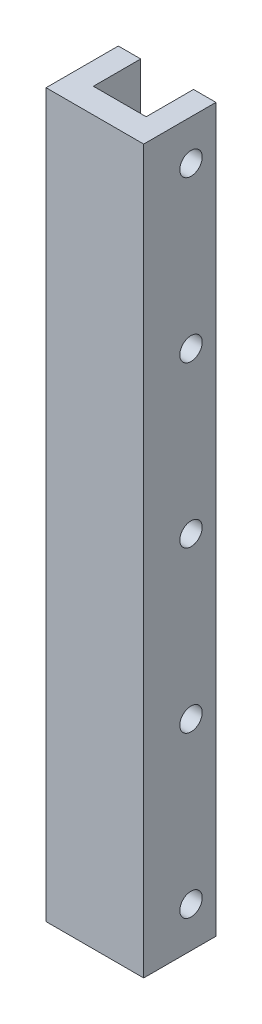
ISO-10303-21;
HEADER;
FILE_DESCRIPTION(('STEP AP214'),'2;1');
FILE_NAME('part.step','',(''),(''),'','','');
FILE_SCHEMA(('AUTOMOTIVE_DESIGN { 1 0 10303 214 1 1 1 1 }'));
ENDSEC;
DATA;
#1=APPLICATION_CONTEXT('core data for automotive mechanical design processes');
#2=APPLICATION_PROTOCOL_DEFINITION('international standard','automotive_design',2000,#1);
#3=PRODUCT_CONTEXT('',#1,'mechanical');
#4=PRODUCT('Part','Part','',(#3));
#5=PRODUCT_RELATED_PRODUCT_CATEGORY('part','',(#4));
#6=PRODUCT_DEFINITION_FORMATION('','',#4);
#7=PRODUCT_DEFINITION_CONTEXT('part definition',#1,'design');
#8=PRODUCT_DEFINITION('design','',#6,#7);
#9=PRODUCT_DEFINITION_SHAPE('','',#8);
#10=(LENGTH_UNIT() NAMED_UNIT(*) SI_UNIT(.MILLI.,.METRE.));
#11=(NAMED_UNIT(*) PLANE_ANGLE_UNIT() SI_UNIT($,.RADIAN.));
#12=(NAMED_UNIT(*) SI_UNIT($,.STERADIAN.) SOLID_ANGLE_UNIT());
#13=UNCERTAINTY_MEASURE_WITH_UNIT(LENGTH_MEASURE(1.E-05),#10,'distance_accuracy_value','');
#14=(GEOMETRIC_REPRESENTATION_CONTEXT(3) GLOBAL_UNCERTAINTY_ASSIGNED_CONTEXT((#13)) GLOBAL_UNIT_ASSIGNED_CONTEXT((#10,
#11,#12)) REPRESENTATION_CONTEXT('',''));
#15=CARTESIAN_POINT('',(0.,0.,0.));
#16=DIRECTION('',(0.,0.,1.));
#17=DIRECTION('',(1.,0.,0.));
#18=AXIS2_PLACEMENT_3D('',#15,#16,#17);
#19=CARTESIAN_POINT('',(0.,145.,-9.5));
#20=DIRECTION('',(-1.,0.,0.));
#21=DIRECTION('',(0.,0.,1.));
#22=AXIS2_PLACEMENT_3D('',#19,#20,#21);
#23=PLANE('',#22);
#24=CARTESIAN_POINT('',(0.,136.9,-4.4999999999997));
#25=DIRECTION('',(-1.,0.,0.));
#26=DIRECTION('',(0.,0.,1.));
#27=AXIS2_PLACEMENT_3D('',#24,#25,#26);
#28=CIRCLE('',#27,2.25);
#29=CARTESIAN_POINT('',(0.,136.9,-2.2499999999997));
#30=VERTEX_POINT('',#29);
#31=EDGE_CURVE('E137',#30,#30,#28,.T.);
#32=ORIENTED_EDGE('',*,*,#31,.T.);
#33=EDGE_LOOP('',(#32));
#34=FACE_BOUND('',#33,.T.);
#35=CARTESIAN_POINT('',(0.,104.7,-4.49999999999984));
#36=DIRECTION('',(-1.,0.,0.));
#37=DIRECTION('',(0.,0.,1.));
#38=AXIS2_PLACEMENT_3D('',#35,#36,#37);
#39=CIRCLE('',#38,2.25);
#40=CARTESIAN_POINT('',(0.,104.7,-2.24999999999984));
#41=VERTEX_POINT('',#40);
#42=EDGE_CURVE('E174',#41,#41,#39,.T.);
#43=ORIENTED_EDGE('',*,*,#42,.T.);
#44=EDGE_LOOP('',(#43));
#45=FACE_BOUND('',#44,.T.);
#46=CARTESIAN_POINT('',(0.,72.5,-4.49999999999995));
#47=DIRECTION('',(-1.,0.,0.));
#48=DIRECTION('',(0.,0.,1.));
#49=AXIS2_PLACEMENT_3D('',#46,#47,#48);
#50=CIRCLE('',#49,2.25);
#51=CARTESIAN_POINT('',(0.,72.5,-2.24999999999995));
#52=VERTEX_POINT('',#51);
#53=EDGE_CURVE('E171',#52,#52,#50,.T.);
#54=ORIENTED_EDGE('',*,*,#53,.T.);
#55=EDGE_LOOP('',(#54));
#56=FACE_BOUND('',#55,.T.);
#57=CARTESIAN_POINT('',(0.,8.09999999999995,-4.50000000000019));
#58=DIRECTION('',(-1.,0.,0.));
#59=DIRECTION('',(0.,0.,1.));
#60=AXIS2_PLACEMENT_3D('',#57,#58,#59);
#61=CIRCLE('',#60,2.25);
#62=CARTESIAN_POINT('',(0.,8.09999999999995,-2.25000000000019));
#63=VERTEX_POINT('',#62);
#64=EDGE_CURVE('E168',#63,#63,#61,.T.);
#65=ORIENTED_EDGE('',*,*,#64,.T.);
#66=EDGE_LOOP('',(#65));
#67=FACE_BOUND('',#66,.T.);
#68=CARTESIAN_POINT('',(0.,40.2999999999999,-4.50000000000006));
#69=DIRECTION('',(-1.,0.,0.));
#70=DIRECTION('',(0.,0.,1.));
#71=AXIS2_PLACEMENT_3D('',#68,#69,#70);
#72=CIRCLE('',#71,2.25);
#73=CARTESIAN_POINT('',(0.,40.2999999999999,-2.25000000000006));
#74=VERTEX_POINT('',#73);
#75=EDGE_CURVE('E163',#74,#74,#72,.T.);
#76=ORIENTED_EDGE('',*,*,#75,.T.);
#77=EDGE_LOOP('',(#76));
#78=FACE_BOUND('',#77,.T.);
#79=DIRECTION('',(0.,0.,-1.));
#80=VECTOR('',#79,1.);
#81=CARTESIAN_POINT('',(0.,0.,-9.5));
#82=LINE('',#81,#80);
#83=CARTESIAN_POINT('',(0.,0.,0.));
#84=VERTEX_POINT('',#83);
#85=CARTESIAN_POINT('',(0.,0.,-9.5));
#86=VERTEX_POINT('',#85);
#87=EDGE_CURVE('E133',#84,#86,#82,.T.);
#88=ORIENTED_EDGE('',*,*,#87,.T.);
#89=DIRECTION('',(0.,-1.,0.));
#90=VECTOR('',#89,1.);
#91=CARTESIAN_POINT('',(0.,145.,-9.5));
#92=LINE('',#91,#90);
#93=CARTESIAN_POINT('',(0.,145.,-9.5));
#94=VERTEX_POINT('',#93);
#95=EDGE_CURVE('E11',#94,#86,#92,.T.);
#96=ORIENTED_EDGE('',*,*,#95,.F.);
#97=DIRECTION('',(0.,0.,-1.));
#98=VECTOR('',#97,1.);
#99=CARTESIAN_POINT('',(0.,145.,-9.5));
#100=LINE('',#99,#98);
#101=CARTESIAN_POINT('',(0.,145.,0.));
#102=VERTEX_POINT('',#101);
#103=EDGE_CURVE('E148',#102,#94,#100,.T.);
#104=ORIENTED_EDGE('',*,*,#103,.F.);
#105=DIRECTION('',(0.,-1.,0.));
#106=VECTOR('',#105,1.);
#107=CARTESIAN_POINT('',(0.,145.,0.));
#108=LINE('',#107,#106);
#109=EDGE_CURVE('E129',#102,#84,#108,.T.);
#110=ORIENTED_EDGE('',*,*,#109,.T.);
#111=EDGE_LOOP('',(#88,#96,#104,#110));
#112=FACE_BOUND('',#111,.T.);
#113=ADVANCED_FACE('F35',(#34,#45,#56,#67,#78,#112),#23,.F.);
#114=CARTESIAN_POINT('',(-4.5,145.,-9.5));
#115=DIRECTION('',(0.,0.,1.));
#116=DIRECTION('',(1.,0.,0.));
#117=AXIS2_PLACEMENT_3D('',#114,#115,#116);
#118=PLANE('',#117);
#119=DIRECTION('',(-1.,0.,0.));
#120=VECTOR('',#119,1.);
#121=CARTESIAN_POINT('',(-4.5,0.,-9.5));
#122=LINE('',#121,#120);
#123=CARTESIAN_POINT('',(-4.5,0.,-9.5));
#124=VERTEX_POINT('',#123);
#125=EDGE_CURVE('E136',#86,#124,#122,.T.);
#126=ORIENTED_EDGE('',*,*,#125,.T.);
#127=DIRECTION('',(0.,-1.,0.));
#128=VECTOR('',#127,1.);
#129=CARTESIAN_POINT('',(-4.5,145.,-9.5));
#130=LINE('',#129,#128);
#131=CARTESIAN_POINT('',(-4.5,145.,-9.5));
#132=VERTEX_POINT('',#131);
#133=EDGE_CURVE('E44',#132,#124,#130,.T.);
#134=ORIENTED_EDGE('',*,*,#133,.F.);
#135=DIRECTION('',(-1.,0.,0.));
#136=VECTOR('',#135,1.);
#137=CARTESIAN_POINT('',(-4.5,145.,-9.5));
#138=LINE('',#137,#136);
#139=EDGE_CURVE('E96',#94,#132,#138,.T.);
#140=ORIENTED_EDGE('',*,*,#139,.F.);
#141=ORIENTED_EDGE('',*,*,#95,.T.);
#142=EDGE_LOOP('',(#126,#134,#140,#141));
#143=FACE_BOUND('',#142,.T.);
#144=ADVANCED_FACE('F222',(#143),#118,.F.);
#145=CARTESIAN_POINT('',(-4.5,145.,5.));
#146=DIRECTION('',(1.,0.,0.));
#147=DIRECTION('',(0.,0.,-1.));
#148=AXIS2_PLACEMENT_3D('',#145,#146,#147);
#149=PLANE('',#148);
#150=CARTESIAN_POINT('',(-4.5,136.9,-4.4999999999997));
#151=DIRECTION('',(1.,0.,0.));
#152=DIRECTION('',(0.,0.,-1.));
#153=AXIS2_PLACEMENT_3D('',#150,#151,#152);
#154=CIRCLE('',#153,2.25);
#155=CARTESIAN_POINT('',(-4.5,136.9,-6.7499999999997));
#156=VERTEX_POINT('',#155);
#157=EDGE_CURVE('E248',#156,#156,#154,.T.);
#158=ORIENTED_EDGE('',*,*,#157,.T.);
#159=EDGE_LOOP('',(#158));
#160=FACE_BOUND('',#159,.T.);
#161=CARTESIAN_POINT('',(-4.5,104.7,-4.49999999999984));
#162=DIRECTION('',(1.,0.,0.));
#163=DIRECTION('',(0.,0.,-1.));
#164=AXIS2_PLACEMENT_3D('',#161,#162,#163);
#165=CIRCLE('',#164,2.25);
#166=CARTESIAN_POINT('',(-4.5,104.7,-6.74999999999984));
#167=VERTEX_POINT('',#166);
#168=EDGE_CURVE('E254',#167,#167,#165,.T.);
#169=ORIENTED_EDGE('',*,*,#168,.T.);
#170=EDGE_LOOP('',(#169));
#171=FACE_BOUND('',#170,.T.);
#172=CARTESIAN_POINT('',(-4.5,72.5,-4.49999999999995));
#173=DIRECTION('',(1.,0.,0.));
#174=DIRECTION('',(0.,0.,-1.));
#175=AXIS2_PLACEMENT_3D('',#172,#173,#174);
#176=CIRCLE('',#175,2.25);
#177=CARTESIAN_POINT('',(-4.5,72.5,-6.74999999999995));
#178=VERTEX_POINT('',#177);
#179=EDGE_CURVE('E260',#178,#178,#176,.T.);
#180=ORIENTED_EDGE('',*,*,#179,.T.);
#181=EDGE_LOOP('',(#180));
#182=FACE_BOUND('',#181,.T.);
#183=CARTESIAN_POINT('',(-4.5,8.09999999999995,-4.50000000000019));
#184=DIRECTION('',(1.,0.,0.));
#185=DIRECTION('',(0.,0.,-1.));
#186=AXIS2_PLACEMENT_3D('',#183,#184,#185);
#187=CIRCLE('',#186,2.25);
#188=CARTESIAN_POINT('',(-4.5,8.09999999999995,-6.75000000000019));
#189=VERTEX_POINT('',#188);
#190=EDGE_CURVE('E242',#189,#189,#187,.T.);
#191=ORIENTED_EDGE('',*,*,#190,.T.);
#192=EDGE_LOOP('',(#191));
#193=FACE_BOUND('',#192,.T.);
#194=CARTESIAN_POINT('',(-4.5,40.2999999999999,-4.50000000000006));
#195=DIRECTION('',(1.,0.,0.));
#196=DIRECTION('',(0.,0.,-1.));
#197=AXIS2_PLACEMENT_3D('',#194,#195,#196);
#198=CIRCLE('',#197,2.25);
#199=CARTESIAN_POINT('',(-4.5,40.2999999999999,-6.75000000000006));
#200=VERTEX_POINT('',#199);
#201=EDGE_CURVE('E164',#200,#200,#198,.T.);
#202=ORIENTED_EDGE('',*,*,#201,.T.);
#203=EDGE_LOOP('',(#202));
#204=FACE_BOUND('',#203,.T.);
#205=DIRECTION('',(0.,0.,1.));
#206=VECTOR('',#205,1.);
#207=CARTESIAN_POINT('',(-4.5,0.,5.));
#208=LINE('',#207,#206);
#209=CARTESIAN_POINT('',(-4.5,0.,5.));
#210=VERTEX_POINT('',#209);
#211=EDGE_CURVE('E139',#124,#210,#208,.T.);
#212=ORIENTED_EDGE('',*,*,#211,.T.);
#213=DIRECTION('',(0.,-1.,0.));
#214=VECTOR('',#213,1.);
#215=CARTESIAN_POINT('',(-4.5,145.,5.));
#216=LINE('',#215,#214);
#217=CARTESIAN_POINT('',(-4.5,145.,5.));
#218=VERTEX_POINT('',#217);
#219=EDGE_CURVE('E155',#218,#210,#216,.T.);
#220=ORIENTED_EDGE('',*,*,#219,.F.);
#221=DIRECTION('',(0.,0.,1.));
#222=VECTOR('',#221,1.);
#223=CARTESIAN_POINT('',(-4.5,145.,5.));
#224=LINE('',#223,#222);
#225=EDGE_CURVE('E190',#132,#218,#224,.T.);
#226=ORIENTED_EDGE('',*,*,#225,.F.);
#227=ORIENTED_EDGE('',*,*,#133,.T.);
#228=EDGE_LOOP('',(#212,#220,#226,#227));
#229=FACE_BOUND('',#228,.T.);
#230=ADVANCED_FACE('F227',(#160,#171,#182,#193,#204,#229),#149,.F.);
#231=CARTESIAN_POINT('',(15.1,145.,5.));
#232=DIRECTION('',(0.,0.,-1.));
#233=DIRECTION('',(-1.,0.,0.));
#234=AXIS2_PLACEMENT_3D('',#231,#232,#233);
#235=PLANE('',#234);
#236=DIRECTION('',(1.,0.,0.));
#237=VECTOR('',#236,1.);
#238=CARTESIAN_POINT('',(15.1,0.,5.));
#239=LINE('',#238,#237);
#240=CARTESIAN_POINT('',(15.1,0.,5.));
#241=VERTEX_POINT('',#240);
#242=EDGE_CURVE('E141',#210,#241,#239,.T.);
#243=ORIENTED_EDGE('',*,*,#242,.T.);
#244=DIRECTION('',(0.,-1.,0.));
#245=VECTOR('',#244,1.);
#246=CARTESIAN_POINT('',(15.1,145.,5.));
#247=LINE('',#246,#245);
#248=CARTESIAN_POINT('',(15.1,145.,5.));
#249=VERTEX_POINT('',#248);
#250=EDGE_CURVE('E152',#249,#241,#247,.T.);
#251=ORIENTED_EDGE('',*,*,#250,.F.);
#252=DIRECTION('',(1.,0.,0.));
#253=VECTOR('',#252,1.);
#254=CARTESIAN_POINT('',(15.1,145.,5.));
#255=LINE('',#254,#253);
#256=EDGE_CURVE('E192',#218,#249,#255,.T.);
#257=ORIENTED_EDGE('',*,*,#256,.F.);
#258=ORIENTED_EDGE('',*,*,#219,.T.);
#259=EDGE_LOOP('',(#243,#251,#257,#258));
#260=FACE_BOUND('',#259,.T.);
#261=ADVANCED_FACE('F198',(#260),#235,.F.);
#262=CARTESIAN_POINT('',(15.1,145.,-9.5));
#263=DIRECTION('',(-1.,0.,0.));
#264=DIRECTION('',(0.,0.,1.));
#265=AXIS2_PLACEMENT_3D('',#262,#263,#264);
#266=PLANE('',#265);
#267=CARTESIAN_POINT('',(15.1,136.9,-4.49999999999971));
#268=DIRECTION('',(1.,0.,0.));
#269=DIRECTION('',(0.,0.,-1.));
#270=AXIS2_PLACEMENT_3D('',#267,#268,#269);
#271=CIRCLE('',#270,2.25);
#272=CARTESIAN_POINT('',(15.1,136.9,-6.74999999999971));
#273=VERTEX_POINT('',#272);
#274=EDGE_CURVE('E245',#273,#273,#271,.T.);
#275=ORIENTED_EDGE('',*,*,#274,.F.);
#276=EDGE_LOOP('',(#275));
#277=FACE_BOUND('',#276,.T.);
#278=CARTESIAN_POINT('',(15.1,104.7,-4.49999999999985));
#279=DIRECTION('',(1.,0.,0.));
#280=DIRECTION('',(0.,0.,-1.));
#281=AXIS2_PLACEMENT_3D('',#278,#279,#280);
#282=CIRCLE('',#281,2.25);
#283=CARTESIAN_POINT('',(15.1,104.7,-6.74999999999985));
#284=VERTEX_POINT('',#283);
#285=EDGE_CURVE('E251',#284,#284,#282,.T.);
#286=ORIENTED_EDGE('',*,*,#285,.F.);
#287=EDGE_LOOP('',(#286));
#288=FACE_BOUND('',#287,.T.);
#289=CARTESIAN_POINT('',(15.1,72.5,-4.49999999999996));
#290=DIRECTION('',(1.,0.,0.));
#291=DIRECTION('',(0.,0.,-1.));
#292=AXIS2_PLACEMENT_3D('',#289,#290,#291);
#293=CIRCLE('',#292,2.25);
#294=CARTESIAN_POINT('',(15.1,72.5,-6.74999999999996));
#295=VERTEX_POINT('',#294);
#296=EDGE_CURVE('E257',#295,#295,#293,.T.);
#297=ORIENTED_EDGE('',*,*,#296,.F.);
#298=EDGE_LOOP('',(#297));
#299=FACE_BOUND('',#298,.T.);
#300=CARTESIAN_POINT('',(15.1,8.09999999999995,-4.5000000000002));
#301=DIRECTION('',(1.,0.,0.));
#302=DIRECTION('',(0.,0.,-1.));
#303=AXIS2_PLACEMENT_3D('',#300,#301,#302);
#304=CIRCLE('',#303,2.25);
#305=CARTESIAN_POINT('',(15.1,8.09999999999995,-6.7500000000002));
#306=VERTEX_POINT('',#305);
#307=EDGE_CURVE('E263',#306,#306,#304,.T.);
#308=ORIENTED_EDGE('',*,*,#307,.F.);
#309=EDGE_LOOP('',(#308));
#310=FACE_BOUND('',#309,.T.);
#311=CARTESIAN_POINT('',(15.1,40.2999999999999,-4.50000000000007));
#312=DIRECTION('',(1.,0.,0.));
#313=DIRECTION('',(0.,0.,-1.));
#314=AXIS2_PLACEMENT_3D('',#311,#312,#313);
#315=CIRCLE('',#314,2.25);
#316=CARTESIAN_POINT('',(15.1,40.2999999999999,-6.75000000000007));
#317=VERTEX_POINT('',#316);
#318=EDGE_CURVE('E239',#317,#317,#315,.T.);
#319=ORIENTED_EDGE('',*,*,#318,.F.);
#320=EDGE_LOOP('',(#319));
#321=FACE_BOUND('',#320,.T.);
#322=DIRECTION('',(0.,0.,-1.));
#323=VECTOR('',#322,1.);
#324=CARTESIAN_POINT('',(15.1,0.,-9.5));
#325=LINE('',#324,#323);
#326=CARTESIAN_POINT('',(15.1,0.,-9.5));
#327=VERTEX_POINT('',#326);
#328=EDGE_CURVE('E143',#241,#327,#325,.T.);
#329=ORIENTED_EDGE('',*,*,#328,.T.);
#330=DIRECTION('',(0.,-1.,0.));
#331=VECTOR('',#330,1.);
#332=CARTESIAN_POINT('',(15.1,145.,-9.5));
#333=LINE('',#332,#331);
#334=CARTESIAN_POINT('',(15.1,145.,-9.5));
#335=VERTEX_POINT('',#334);
#336=EDGE_CURVE('E124',#335,#327,#333,.T.);
#337=ORIENTED_EDGE('',*,*,#336,.F.);
#338=DIRECTION('',(0.,0.,-1.));
#339=VECTOR('',#338,1.);
#340=CARTESIAN_POINT('',(15.1,145.,-9.5));
#341=LINE('',#340,#339);
#342=EDGE_CURVE('E115',#249,#335,#341,.T.);
#343=ORIENTED_EDGE('',*,*,#342,.F.);
#344=ORIENTED_EDGE('',*,*,#250,.T.);
#345=EDGE_LOOP('',(#329,#337,#343,#344));
#346=FACE_BOUND('',#345,.T.);
#347=ADVANCED_FACE('F202',(#277,#288,#299,#310,#321,#346),#266,.F.);
#348=CARTESIAN_POINT('',(10.6,145.,-9.5));
#349=DIRECTION('',(0.,0.,1.));
#350=DIRECTION('',(1.,0.,0.));
#351=AXIS2_PLACEMENT_3D('',#348,#349,#350);
#352=PLANE('',#351);
#353=DIRECTION('',(-1.,0.,0.));
#354=VECTOR('',#353,1.);
#355=CARTESIAN_POINT('',(10.6,0.,-9.5));
#356=LINE('',#355,#354);
#357=CARTESIAN_POINT('',(10.6,0.,-9.5));
#358=VERTEX_POINT('',#357);
#359=EDGE_CURVE('E123',#327,#358,#356,.T.);
#360=ORIENTED_EDGE('',*,*,#359,.T.);
#361=DIRECTION('',(0.,-1.,0.));
#362=VECTOR('',#361,1.);
#363=CARTESIAN_POINT('',(10.6,145.,-9.5));
#364=LINE('',#363,#362);
#365=CARTESIAN_POINT('',(10.6,145.,-9.5));
#366=VERTEX_POINT('',#365);
#367=EDGE_CURVE('E120',#366,#358,#364,.T.);
#368=ORIENTED_EDGE('',*,*,#367,.F.);
#369=DIRECTION('',(-1.,0.,0.));
#370=VECTOR('',#369,1.);
#371=CARTESIAN_POINT('',(10.6,145.,-9.5));
#372=LINE('',#371,#370);
#373=EDGE_CURVE('E109',#335,#366,#372,.T.);
#374=ORIENTED_EDGE('',*,*,#373,.F.);
#375=ORIENTED_EDGE('',*,*,#336,.T.);
#376=EDGE_LOOP('',(#360,#368,#374,#375));
#377=FACE_BOUND('',#376,.T.);
#378=ADVANCED_FACE('F121',(#377),#352,.F.);
#379=CARTESIAN_POINT('',(10.6,145.,0.));
#380=DIRECTION('',(1.,0.,0.));
#381=DIRECTION('',(0.,0.,-1.));
#382=AXIS2_PLACEMENT_3D('',#379,#380,#381);
#383=PLANE('',#382);
#384=CARTESIAN_POINT('',(10.6,136.9,-4.49999999999971));
#385=DIRECTION('',(1.,0.,0.));
#386=DIRECTION('',(0.,0.,-1.));
#387=AXIS2_PLACEMENT_3D('',#384,#385,#386);
#388=CIRCLE('',#387,2.25);
#389=CARTESIAN_POINT('',(10.6,136.9,-6.74999999999971));
#390=VERTEX_POINT('',#389);
#391=EDGE_CURVE('E38',#390,#390,#388,.T.);
#392=ORIENTED_EDGE('',*,*,#391,.T.);
#393=EDGE_LOOP('',(#392));
#394=FACE_BOUND('',#393,.T.);
#395=CARTESIAN_POINT('',(10.6,104.7,-4.49999999999984));
#396=DIRECTION('',(1.,0.,0.));
#397=DIRECTION('',(0.,0.,-1.));
#398=AXIS2_PLACEMENT_3D('',#395,#396,#397);
#399=CIRCLE('',#398,2.25);
#400=CARTESIAN_POINT('',(10.6,104.7,-6.74999999999984));
#401=VERTEX_POINT('',#400);
#402=EDGE_CURVE('E172',#401,#401,#399,.T.);
#403=ORIENTED_EDGE('',*,*,#402,.T.);
#404=EDGE_LOOP('',(#403));
#405=FACE_BOUND('',#404,.T.);
#406=CARTESIAN_POINT('',(10.6,72.5,-4.49999999999996));
#407=DIRECTION('',(1.,0.,0.));
#408=DIRECTION('',(0.,0.,-1.));
#409=AXIS2_PLACEMENT_3D('',#406,#407,#408);
#410=CIRCLE('',#409,2.25);
#411=CARTESIAN_POINT('',(10.6,72.5,-6.74999999999996));
#412=VERTEX_POINT('',#411);
#413=EDGE_CURVE('E169',#412,#412,#410,.T.);
#414=ORIENTED_EDGE('',*,*,#413,.T.);
#415=EDGE_LOOP('',(#414));
#416=FACE_BOUND('',#415,.T.);
#417=CARTESIAN_POINT('',(10.6,8.09999999999995,-4.50000000000019));
#418=DIRECTION('',(1.,0.,0.));
#419=DIRECTION('',(0.,0.,-1.));
#420=AXIS2_PLACEMENT_3D('',#417,#418,#419);
#421=CIRCLE('',#420,2.25);
#422=CARTESIAN_POINT('',(10.6,8.09999999999995,-6.7500000000002));
#423=VERTEX_POINT('',#422);
#424=EDGE_CURVE('E165',#423,#423,#421,.T.);
#425=ORIENTED_EDGE('',*,*,#424,.T.);
#426=EDGE_LOOP('',(#425));
#427=FACE_BOUND('',#426,.T.);
#428=CARTESIAN_POINT('',(10.6,40.2999999999999,-4.50000000000007));
#429=DIRECTION('',(1.,0.,0.));
#430=DIRECTION('',(0.,0.,-1.));
#431=AXIS2_PLACEMENT_3D('',#428,#429,#430);
#432=CIRCLE('',#431,2.25);
#433=CARTESIAN_POINT('',(10.6,40.2999999999999,-6.75000000000007));
#434=VERTEX_POINT('',#433);
#435=EDGE_CURVE('E160',#434,#434,#432,.T.);
#436=ORIENTED_EDGE('',*,*,#435,.T.);
#437=EDGE_LOOP('',(#436));
#438=FACE_BOUND('',#437,.T.);
#439=DIRECTION('',(0.,0.,1.));
#440=VECTOR('',#439,1.);
#441=CARTESIAN_POINT('',(10.6,0.,0.));
#442=LINE('',#441,#440);
#443=CARTESIAN_POINT('',(10.6,0.,0.));
#444=VERTEX_POINT('',#443);
#445=EDGE_CURVE('E82',#358,#444,#442,.T.);
#446=ORIENTED_EDGE('',*,*,#445,.T.);
#447=DIRECTION('',(0.,-1.,0.));
#448=VECTOR('',#447,1.);
#449=CARTESIAN_POINT('',(10.6,145.,0.));
#450=LINE('',#449,#448);
#451=CARTESIAN_POINT('',(10.6,145.,0.));
#452=VERTEX_POINT('',#451);
#453=EDGE_CURVE('E125',#452,#444,#450,.T.);
#454=ORIENTED_EDGE('',*,*,#453,.F.);
#455=DIRECTION('',(0.,0.,1.));
#456=VECTOR('',#455,1.);
#457=CARTESIAN_POINT('',(10.6,145.,0.));
#458=LINE('',#457,#456);
#459=EDGE_CURVE('E113',#366,#452,#458,.T.);
#460=ORIENTED_EDGE('',*,*,#459,.F.);
#461=ORIENTED_EDGE('',*,*,#367,.T.);
#462=EDGE_LOOP('',(#446,#454,#460,#461));
#463=FACE_BOUND('',#462,.T.);
#464=ADVANCED_FACE('F127',(#394,#405,#416,#427,#438,#463),#383,.F.);
#465=CARTESIAN_POINT('',(0.,145.,0.));
#466=DIRECTION('',(0.,0.,1.));
#467=DIRECTION('',(1.,0.,0.));
#468=AXIS2_PLACEMENT_3D('',#465,#466,#467);
#469=PLANE('',#468);
#470=DIRECTION('',(-1.,0.,0.));
#471=VECTOR('',#470,1.);
#472=CARTESIAN_POINT('',(0.,0.,0.));
#473=LINE('',#472,#471);
#474=EDGE_CURVE('E88',#444,#84,#473,.T.);
#475=ORIENTED_EDGE('',*,*,#474,.T.);
#476=ORIENTED_EDGE('',*,*,#109,.F.);
#477=DIRECTION('',(-1.,0.,0.));
#478=VECTOR('',#477,1.);
#479=CARTESIAN_POINT('',(0.,145.,0.));
#480=LINE('',#479,#478);
#481=EDGE_CURVE('E53',#452,#102,#480,.T.);
#482=ORIENTED_EDGE('',*,*,#481,.F.);
#483=ORIENTED_EDGE('',*,*,#453,.T.);
#484=EDGE_LOOP('',(#475,#476,#482,#483));
#485=FACE_BOUND('',#484,.T.);
#486=ADVANCED_FACE('F210',(#485),#469,.F.);
#487=CARTESIAN_POINT('',(0.,145.,0.));
#488=DIRECTION('',(0.,1.,0.));
#489=DIRECTION('',(0.,0.,1.));
#490=AXIS2_PLACEMENT_3D('',#487,#488,#489);
#491=PLANE('',#490);
#492=ORIENTED_EDGE('',*,*,#103,.T.);
#493=ORIENTED_EDGE('',*,*,#139,.T.);
#494=ORIENTED_EDGE('',*,*,#225,.T.);
#495=ORIENTED_EDGE('',*,*,#256,.T.);
#496=ORIENTED_EDGE('',*,*,#342,.T.);
#497=ORIENTED_EDGE('',*,*,#373,.T.);
#498=ORIENTED_EDGE('',*,*,#459,.T.);
#499=ORIENTED_EDGE('',*,*,#481,.T.);
#500=EDGE_LOOP('',(#492,#493,#494,#495,#496,#497,#498,#499));
#501=FACE_BOUND('',#500,.T.);
#502=ADVANCED_FACE('F111',(#501),#491,.T.);
#503=CARTESIAN_POINT('',(0.,0.,0.));
#504=DIRECTION('',(0.,1.,0.));
#505=DIRECTION('',(0.,0.,1.));
#506=AXIS2_PLACEMENT_3D('',#503,#504,#505);
#507=PLANE('',#506);
#508=ORIENTED_EDGE('',*,*,#87,.F.);
#509=ORIENTED_EDGE('',*,*,#474,.F.);
#510=ORIENTED_EDGE('',*,*,#445,.F.);
#511=ORIENTED_EDGE('',*,*,#359,.F.);
#512=ORIENTED_EDGE('',*,*,#328,.F.);
#513=ORIENTED_EDGE('',*,*,#242,.F.);
#514=ORIENTED_EDGE('',*,*,#211,.F.);
#515=ORIENTED_EDGE('',*,*,#125,.F.);
#516=EDGE_LOOP('',(#508,#509,#510,#511,#512,#513,#514,#515));
#517=FACE_BOUND('',#516,.T.);
#518=ADVANCED_FACE('F205',(#517),#507,.F.);
#519=CARTESIAN_POINT('',(-4.5,40.2999999999999,-4.50000000000006));
#520=DIRECTION('',(1.,0.,0.));
#521=DIRECTION('',(0.,0.,-1.));
#522=AXIS2_PLACEMENT_3D('',#519,#520,#521);
#523=CYLINDRICAL_SURFACE('',#522,2.25);
#524=ORIENTED_EDGE('',*,*,#318,.T.);
#525=EDGE_LOOP('',(#524));
#526=FACE_BOUND('',#525,.T.);
#527=ORIENTED_EDGE('',*,*,#435,.F.);
#528=EDGE_LOOP('',(#527));
#529=FACE_BOUND('',#528,.T.);
#530=ADVANCED_FACE('F289',(#526,#529),#523,.F.);
#531=CARTESIAN_POINT('',(-4.5,8.09999999999995,-4.50000000000019));
#532=DIRECTION('',(1.,0.,0.));
#533=DIRECTION('',(0.,0.,-1.));
#534=AXIS2_PLACEMENT_3D('',#531,#532,#533);
#535=CYLINDRICAL_SURFACE('',#534,2.25);
#536=ORIENTED_EDGE('',*,*,#307,.T.);
#537=EDGE_LOOP('',(#536));
#538=FACE_BOUND('',#537,.T.);
#539=ORIENTED_EDGE('',*,*,#424,.F.);
#540=EDGE_LOOP('',(#539));
#541=FACE_BOUND('',#540,.T.);
#542=ADVANCED_FACE('F277',(#538,#541),#535,.F.);
#543=CARTESIAN_POINT('',(-4.5,72.5,-4.49999999999995));
#544=DIRECTION('',(1.,0.,0.));
#545=DIRECTION('',(0.,0.,-1.));
#546=AXIS2_PLACEMENT_3D('',#543,#544,#545);
#547=CYLINDRICAL_SURFACE('',#546,2.25);
#548=ORIENTED_EDGE('',*,*,#296,.T.);
#549=EDGE_LOOP('',(#548));
#550=FACE_BOUND('',#549,.T.);
#551=ORIENTED_EDGE('',*,*,#413,.F.);
#552=EDGE_LOOP('',(#551));
#553=FACE_BOUND('',#552,.T.);
#554=ADVANCED_FACE('F285',(#550,#553),#547,.F.);
#555=CARTESIAN_POINT('',(-4.5,104.7,-4.49999999999984));
#556=DIRECTION('',(1.,0.,0.));
#557=DIRECTION('',(0.,0.,-1.));
#558=AXIS2_PLACEMENT_3D('',#555,#556,#557);
#559=CYLINDRICAL_SURFACE('',#558,2.25);
#560=ORIENTED_EDGE('',*,*,#285,.T.);
#561=EDGE_LOOP('',(#560));
#562=FACE_BOUND('',#561,.T.);
#563=ORIENTED_EDGE('',*,*,#402,.F.);
#564=EDGE_LOOP('',(#563));
#565=FACE_BOUND('',#564,.T.);
#566=ADVANCED_FACE('F296',(#562,#565),#559,.F.);
#567=CARTESIAN_POINT('',(-4.5,136.9,-4.4999999999997));
#568=DIRECTION('',(1.,0.,0.));
#569=DIRECTION('',(0.,0.,-1.));
#570=AXIS2_PLACEMENT_3D('',#567,#568,#569);
#571=CYLINDRICAL_SURFACE('',#570,2.25);
#572=ORIENTED_EDGE('',*,*,#274,.T.);
#573=EDGE_LOOP('',(#572));
#574=FACE_BOUND('',#573,.T.);
#575=ORIENTED_EDGE('',*,*,#391,.F.);
#576=EDGE_LOOP('',(#575));
#577=FACE_BOUND('',#576,.T.);
#578=ADVANCED_FACE('F286',(#574,#577),#571,.F.);
#579=ORIENTED_EDGE('',*,*,#201,.F.);
#580=EDGE_LOOP('',(#579));
#581=FACE_BOUND('',#580,.T.);
#582=ORIENTED_EDGE('',*,*,#75,.F.);
#583=EDGE_LOOP('',(#582));
#584=FACE_BOUND('',#583,.T.);
#585=ADVANCED_FACE('F275',(#581,#584),#523,.F.);
#586=ORIENTED_EDGE('',*,*,#190,.F.);
#587=EDGE_LOOP('',(#586));
#588=FACE_BOUND('',#587,.T.);
#589=ORIENTED_EDGE('',*,*,#64,.F.);
#590=EDGE_LOOP('',(#589));
#591=FACE_BOUND('',#590,.T.);
#592=ADVANCED_FACE('F271',(#588,#591),#535,.F.);
#593=ORIENTED_EDGE('',*,*,#179,.F.);
#594=EDGE_LOOP('',(#593));
#595=FACE_BOUND('',#594,.T.);
#596=ORIENTED_EDGE('',*,*,#53,.F.);
#597=EDGE_LOOP('',(#596));
#598=FACE_BOUND('',#597,.T.);
#599=ADVANCED_FACE('F274',(#595,#598),#547,.F.);
#600=ORIENTED_EDGE('',*,*,#168,.F.);
#601=EDGE_LOOP('',(#600));
#602=FACE_BOUND('',#601,.T.);
#603=ORIENTED_EDGE('',*,*,#42,.F.);
#604=EDGE_LOOP('',(#603));
#605=FACE_BOUND('',#604,.T.);
#606=ADVANCED_FACE('F282',(#602,#605),#559,.F.);
#607=ORIENTED_EDGE('',*,*,#157,.F.);
#608=EDGE_LOOP('',(#607));
#609=FACE_BOUND('',#608,.T.);
#610=ORIENTED_EDGE('',*,*,#31,.F.);
#611=EDGE_LOOP('',(#610));
#612=FACE_BOUND('',#611,.T.);
#613=ADVANCED_FACE('F334',(#609,#612),#571,.F.);
#614=CLOSED_SHELL('',(#113,#144,#230,#261,#347,#378,#464,#486,#502,#518,#530,#542,#554,#566,
#578,#585,#592,#599,#606,#613));
#615=MANIFOLD_SOLID_BREP('B2',#614);
#616=ADVANCED_BREP_SHAPE_REPRESENTATION('',(#18,#615),#14);
#617=SHAPE_DEFINITION_REPRESENTATION(#9,#616);
ENDSEC;
END-ISO-10303-21;
